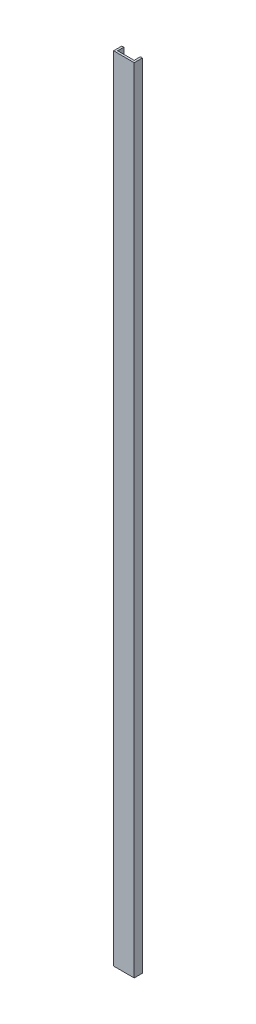
ISO-10303-21;
HEADER;
FILE_DESCRIPTION(('STEP AP214'),'2;1');
FILE_NAME('part.step','',(''),(''),'','','');
FILE_SCHEMA(('AUTOMOTIVE_DESIGN { 1 0 10303 214 1 1 1 1 }'));
ENDSEC;
DATA;
#1=APPLICATION_CONTEXT('core data for automotive mechanical design processes');
#2=APPLICATION_PROTOCOL_DEFINITION('international standard','automotive_design',2000,#1);
#3=PRODUCT_CONTEXT('',#1,'mechanical');
#4=PRODUCT('Part','Part','',(#3));
#5=PRODUCT_RELATED_PRODUCT_CATEGORY('part','',(#4));
#6=PRODUCT_DEFINITION_FORMATION('','',#4);
#7=PRODUCT_DEFINITION_CONTEXT('part definition',#1,'design');
#8=PRODUCT_DEFINITION('design','',#6,#7);
#9=PRODUCT_DEFINITION_SHAPE('','',#8);
#10=(LENGTH_UNIT() NAMED_UNIT(*) SI_UNIT(.MILLI.,.METRE.));
#11=(NAMED_UNIT(*) PLANE_ANGLE_UNIT() SI_UNIT($,.RADIAN.));
#12=(NAMED_UNIT(*) SI_UNIT($,.STERADIAN.) SOLID_ANGLE_UNIT());
#13=UNCERTAINTY_MEASURE_WITH_UNIT(LENGTH_MEASURE(1.E-05),#10,'distance_accuracy_value','');
#14=(GEOMETRIC_REPRESENTATION_CONTEXT(3) GLOBAL_UNCERTAINTY_ASSIGNED_CONTEXT((#13)) GLOBAL_UNIT_ASSIGNED_CONTEXT((#10,
#11,#12)) REPRESENTATION_CONTEXT('',''));
#15=CARTESIAN_POINT('',(0.,0.,0.));
#16=DIRECTION('',(0.,0.,1.));
#17=DIRECTION('',(1.,0.,0.));
#18=AXIS2_PLACEMENT_3D('',#15,#16,#17);
#19=CARTESIAN_POINT('',(0.,1219.2,0.));
#20=DIRECTION('',(1.,0.,0.));
#21=DIRECTION('',(0.,0.,-1.));
#22=AXIS2_PLACEMENT_3D('',#19,#20,#21);
#23=PLANE('',#22);
#24=DIRECTION('',(0.,0.,1.));
#25=VECTOR('',#24,1.);
#26=CARTESIAN_POINT('',(0.,0.,0.));
#27=LINE('',#26,#25);
#28=CARTESIAN_POINT('',(0.,0.,-12.7));
#29=VERTEX_POINT('',#28);
#30=CARTESIAN_POINT('',(0.,0.,0.));
#31=VERTEX_POINT('',#30);
#32=EDGE_CURVE('E136',#29,#31,#27,.T.);
#33=ORIENTED_EDGE('',*,*,#32,.T.);
#34=DIRECTION('',(0.,-1.,0.));
#35=VECTOR('',#34,1.);
#36=CARTESIAN_POINT('',(0.,1219.2,0.));
#37=LINE('',#36,#35);
#38=CARTESIAN_POINT('',(0.,1219.2,0.));
#39=VERTEX_POINT('',#38);
#40=EDGE_CURVE('E11',#39,#31,#37,.T.);
#41=ORIENTED_EDGE('',*,*,#40,.F.);
#42=DIRECTION('',(0.,0.,1.));
#43=VECTOR('',#42,1.);
#44=CARTESIAN_POINT('',(0.,1219.2,0.));
#45=LINE('',#44,#43);
#46=CARTESIAN_POINT('',(0.,1219.2,-12.7));
#47=VERTEX_POINT('',#46);
#48=EDGE_CURVE('E154',#47,#39,#45,.T.);
#49=ORIENTED_EDGE('',*,*,#48,.F.);
#50=DIRECTION('',(0.,-1.,0.));
#51=VECTOR('',#50,1.);
#52=CARTESIAN_POINT('',(0.,1219.2,-12.7));
#53=LINE('',#52,#51);
#54=EDGE_CURVE('E132',#47,#29,#53,.T.);
#55=ORIENTED_EDGE('',*,*,#54,.T.);
#56=EDGE_LOOP('',(#33,#41,#49,#55));
#57=FACE_BOUND('',#56,.T.);
#58=ADVANCED_FACE('F38',(#57),#23,.F.);
#59=CARTESIAN_POINT('',(0.,1219.2,0.));
#60=DIRECTION('',(0.,0.,-1.));
#61=DIRECTION('',(-1.,0.,0.));
#62=AXIS2_PLACEMENT_3D('',#59,#60,#61);
#63=PLANE('',#62);
#64=DIRECTION('',(1.,0.,0.));
#65=VECTOR('',#64,1.);
#66=CARTESIAN_POINT('',(0.,0.,0.));
#67=LINE('',#66,#65);
#68=CARTESIAN_POINT('',(31.75,0.,0.));
#69=VERTEX_POINT('',#68);
#70=EDGE_CURVE('E139',#31,#69,#67,.T.);
#71=ORIENTED_EDGE('',*,*,#70,.T.);
#72=DIRECTION('',(0.,-1.,0.));
#73=VECTOR('',#72,1.);
#74=CARTESIAN_POINT('',(31.75,1219.2,0.));
#75=LINE('',#74,#73);
#76=CARTESIAN_POINT('',(31.75,1219.2,0.));
#77=VERTEX_POINT('',#76);
#78=EDGE_CURVE('E46',#77,#69,#75,.T.);
#79=ORIENTED_EDGE('',*,*,#78,.F.);
#80=DIRECTION('',(1.,0.,0.));
#81=VECTOR('',#80,1.);
#82=CARTESIAN_POINT('',(0.,1219.2,0.));
#83=LINE('',#82,#81);
#84=EDGE_CURVE('E99',#39,#77,#83,.T.);
#85=ORIENTED_EDGE('',*,*,#84,.F.);
#86=ORIENTED_EDGE('',*,*,#40,.T.);
#87=EDGE_LOOP('',(#71,#79,#85,#86));
#88=FACE_BOUND('',#87,.T.);
#89=ADVANCED_FACE('F193',(#88),#63,.F.);
#90=CARTESIAN_POINT('',(31.75,1219.2,0.));
#91=DIRECTION('',(-1.,0.,0.));
#92=DIRECTION('',(0.,0.,1.));
#93=AXIS2_PLACEMENT_3D('',#90,#91,#92);
#94=PLANE('',#93);
#95=DIRECTION('',(0.,0.,-1.));
#96=VECTOR('',#95,1.);
#97=CARTESIAN_POINT('',(31.75,0.,0.));
#98=LINE('',#97,#96);
#99=CARTESIAN_POINT('',(31.75,0.,-12.7));
#100=VERTEX_POINT('',#99);
#101=EDGE_CURVE('E142',#69,#100,#98,.T.);
#102=ORIENTED_EDGE('',*,*,#101,.T.);
#103=DIRECTION('',(0.,-1.,0.));
#104=VECTOR('',#103,1.);
#105=CARTESIAN_POINT('',(31.75,1219.2,-12.7));
#106=LINE('',#105,#104);
#107=CARTESIAN_POINT('',(31.75,1219.2,-12.7));
#108=VERTEX_POINT('',#107);
#109=EDGE_CURVE('E163',#108,#100,#106,.T.);
#110=ORIENTED_EDGE('',*,*,#109,.F.);
#111=DIRECTION('',(0.,0.,-1.));
#112=VECTOR('',#111,1.);
#113=CARTESIAN_POINT('',(31.75,1219.2,0.));
#114=LINE('',#113,#112);
#115=EDGE_CURVE('E173',#77,#108,#114,.T.);
#116=ORIENTED_EDGE('',*,*,#115,.F.);
#117=ORIENTED_EDGE('',*,*,#78,.T.);
#118=EDGE_LOOP('',(#102,#110,#116,#117));
#119=FACE_BOUND('',#118,.T.);
#120=ADVANCED_FACE('F171',(#119),#94,.F.);
#121=CARTESIAN_POINT('',(31.75,1219.2,-12.7));
#122=DIRECTION('',(0.,0.,1.));
#123=DIRECTION('',(1.,0.,0.));
#124=AXIS2_PLACEMENT_3D('',#121,#122,#123);
#125=PLANE('',#124);
#126=DIRECTION('',(-1.,0.,0.));
#127=VECTOR('',#126,1.);
#128=CARTESIAN_POINT('',(31.75,0.,-12.7));
#129=LINE('',#128,#127);
#130=CARTESIAN_POINT('',(28.575,0.,-12.7));
#131=VERTEX_POINT('',#130);
#132=EDGE_CURVE('E145',#100,#131,#129,.T.);
#133=ORIENTED_EDGE('',*,*,#132,.T.);
#134=DIRECTION('',(0.,-1.,0.));
#135=VECTOR('',#134,1.);
#136=CARTESIAN_POINT('',(28.575,1219.2,-12.7));
#137=LINE('',#136,#135);
#138=CARTESIAN_POINT('',(28.575,1219.2,-12.7));
#139=VERTEX_POINT('',#138);
#140=EDGE_CURVE('E159',#139,#131,#137,.T.);
#141=ORIENTED_EDGE('',*,*,#140,.F.);
#142=DIRECTION('',(-1.,0.,0.));
#143=VECTOR('',#142,1.);
#144=CARTESIAN_POINT('',(31.75,1219.2,-12.7));
#145=LINE('',#144,#143);
#146=EDGE_CURVE('E185',#108,#139,#145,.T.);
#147=ORIENTED_EDGE('',*,*,#146,.F.);
#148=ORIENTED_EDGE('',*,*,#109,.T.);
#149=EDGE_LOOP('',(#133,#141,#147,#148));
#150=FACE_BOUND('',#149,.T.);
#151=ADVANCED_FACE('F181',(#150),#125,.F.);
#152=CARTESIAN_POINT('',(28.575,1219.2,-3.175));
#153=DIRECTION('',(1.,0.,0.));
#154=DIRECTION('',(0.,0.,-1.));
#155=AXIS2_PLACEMENT_3D('',#152,#153,#154);
#156=PLANE('',#155);
#157=DIRECTION('',(0.,0.,1.));
#158=VECTOR('',#157,1.);
#159=CARTESIAN_POINT('',(28.575,0.,-3.175));
#160=LINE('',#159,#158);
#161=CARTESIAN_POINT('',(28.575,0.,-3.175));
#162=VERTEX_POINT('',#161);
#163=EDGE_CURVE('E147',#131,#162,#160,.T.);
#164=ORIENTED_EDGE('',*,*,#163,.T.);
#165=DIRECTION('',(0.,-1.,0.));
#166=VECTOR('',#165,1.);
#167=CARTESIAN_POINT('',(28.575,1219.2,-3.175));
#168=LINE('',#167,#166);
#169=CARTESIAN_POINT('',(28.575,1219.2,-3.175));
#170=VERTEX_POINT('',#169);
#171=EDGE_CURVE('E127',#170,#162,#168,.T.);
#172=ORIENTED_EDGE('',*,*,#171,.F.);
#173=DIRECTION('',(0.,0.,1.));
#174=VECTOR('',#173,1.);
#175=CARTESIAN_POINT('',(28.575,1219.2,-3.175));
#176=LINE('',#175,#174);
#177=EDGE_CURVE('E118',#139,#170,#176,.T.);
#178=ORIENTED_EDGE('',*,*,#177,.F.);
#179=ORIENTED_EDGE('',*,*,#140,.T.);
#180=EDGE_LOOP('',(#164,#172,#178,#179));
#181=FACE_BOUND('',#180,.T.);
#182=ADVANCED_FACE('F184',(#181),#156,.F.);
#183=CARTESIAN_POINT('',(3.175,1219.2,-3.175));
#184=DIRECTION('',(0.,0.,1.));
#185=DIRECTION('',(1.,0.,0.));
#186=AXIS2_PLACEMENT_3D('',#183,#184,#185);
#187=PLANE('',#186);
#188=DIRECTION('',(-1.,0.,0.));
#189=VECTOR('',#188,1.);
#190=CARTESIAN_POINT('',(3.175,0.,-3.175));
#191=LINE('',#190,#189);
#192=CARTESIAN_POINT('',(3.175,0.,-3.175));
#193=VERTEX_POINT('',#192);
#194=EDGE_CURVE('E126',#162,#193,#191,.T.);
#195=ORIENTED_EDGE('',*,*,#194,.T.);
#196=DIRECTION('',(0.,-1.,0.));
#197=VECTOR('',#196,1.);
#198=CARTESIAN_POINT('',(3.175,1219.2,-3.175));
#199=LINE('',#198,#197);
#200=CARTESIAN_POINT('',(3.175,1219.2,-3.175));
#201=VERTEX_POINT('',#200);
#202=EDGE_CURVE('E123',#201,#193,#199,.T.);
#203=ORIENTED_EDGE('',*,*,#202,.F.);
#204=DIRECTION('',(-1.,0.,0.));
#205=VECTOR('',#204,1.);
#206=CARTESIAN_POINT('',(3.175,1219.2,-3.175));
#207=LINE('',#206,#205);
#208=EDGE_CURVE('E112',#170,#201,#207,.T.);
#209=ORIENTED_EDGE('',*,*,#208,.F.);
#210=ORIENTED_EDGE('',*,*,#171,.T.);
#211=EDGE_LOOP('',(#195,#203,#209,#210));
#212=FACE_BOUND('',#211,.T.);
#213=ADVANCED_FACE('F124',(#212),#187,.F.);
#214=CARTESIAN_POINT('',(3.175,1219.2,-3.175));
#215=DIRECTION('',(-1.,0.,0.));
#216=DIRECTION('',(0.,0.,1.));
#217=AXIS2_PLACEMENT_3D('',#214,#215,#216);
#218=PLANE('',#217);
#219=DIRECTION('',(0.,0.,-1.));
#220=VECTOR('',#219,1.);
#221=CARTESIAN_POINT('',(3.175,0.,-3.175));
#222=LINE('',#221,#220);
#223=CARTESIAN_POINT('',(3.175,0.,-12.7));
#224=VERTEX_POINT('',#223);
#225=EDGE_CURVE('E85',#193,#224,#222,.T.);
#226=ORIENTED_EDGE('',*,*,#225,.T.);
#227=DIRECTION('',(0.,-1.,0.));
#228=VECTOR('',#227,1.);
#229=CARTESIAN_POINT('',(3.175,1219.2,-12.7));
#230=LINE('',#229,#228);
#231=CARTESIAN_POINT('',(3.175,1219.2,-12.7));
#232=VERTEX_POINT('',#231);
#233=EDGE_CURVE('E128',#232,#224,#230,.T.);
#234=ORIENTED_EDGE('',*,*,#233,.F.);
#235=DIRECTION('',(0.,0.,-1.));
#236=VECTOR('',#235,1.);
#237=CARTESIAN_POINT('',(3.175,1219.2,-3.175));
#238=LINE('',#237,#236);
#239=EDGE_CURVE('E116',#201,#232,#238,.T.);
#240=ORIENTED_EDGE('',*,*,#239,.F.);
#241=ORIENTED_EDGE('',*,*,#202,.T.);
#242=EDGE_LOOP('',(#226,#234,#240,#241));
#243=FACE_BOUND('',#242,.T.);
#244=ADVANCED_FACE('F130',(#243),#218,.F.);
#245=CARTESIAN_POINT('',(0.,1219.2,-12.7));
#246=DIRECTION('',(0.,0.,1.));
#247=DIRECTION('',(1.,0.,0.));
#248=AXIS2_PLACEMENT_3D('',#245,#246,#247);
#249=PLANE('',#248);
#250=DIRECTION('',(-1.,0.,0.));
#251=VECTOR('',#250,1.);
#252=CARTESIAN_POINT('',(0.,0.,-12.7));
#253=LINE('',#252,#251);
#254=EDGE_CURVE('E91',#224,#29,#253,.T.);
#255=ORIENTED_EDGE('',*,*,#254,.T.);
#256=ORIENTED_EDGE('',*,*,#54,.F.);
#257=DIRECTION('',(-1.,0.,0.));
#258=VECTOR('',#257,1.);
#259=CARTESIAN_POINT('',(0.,1219.2,-12.7));
#260=LINE('',#259,#258);
#261=EDGE_CURVE('E54',#232,#47,#260,.T.);
#262=ORIENTED_EDGE('',*,*,#261,.F.);
#263=ORIENTED_EDGE('',*,*,#233,.T.);
#264=EDGE_LOOP('',(#255,#256,#262,#263));
#265=FACE_BOUND('',#264,.T.);
#266=ADVANCED_FACE('F208',(#265),#249,.F.);
#267=CARTESIAN_POINT('',(0.,1219.2,0.));
#268=DIRECTION('',(0.,-1.,0.));
#269=DIRECTION('',(0.,0.,-1.));
#270=AXIS2_PLACEMENT_3D('',#267,#268,#269);
#271=PLANE('',#270);
#272=ORIENTED_EDGE('',*,*,#48,.T.);
#273=ORIENTED_EDGE('',*,*,#84,.T.);
#274=ORIENTED_EDGE('',*,*,#115,.T.);
#275=ORIENTED_EDGE('',*,*,#146,.T.);
#276=ORIENTED_EDGE('',*,*,#177,.T.);
#277=ORIENTED_EDGE('',*,*,#208,.T.);
#278=ORIENTED_EDGE('',*,*,#239,.T.);
#279=ORIENTED_EDGE('',*,*,#261,.T.);
#280=EDGE_LOOP('',(#272,#273,#274,#275,#276,#277,#278,#279));
#281=FACE_BOUND('',#280,.T.);
#282=ADVANCED_FACE('F114',(#281),#271,.F.);
#283=CARTESIAN_POINT('',(0.,0.,0.));
#284=DIRECTION('',(0.,-1.,0.));
#285=DIRECTION('',(0.,0.,-1.));
#286=AXIS2_PLACEMENT_3D('',#283,#284,#285);
#287=PLANE('',#286);
#288=ORIENTED_EDGE('',*,*,#32,.F.);
#289=ORIENTED_EDGE('',*,*,#254,.F.);
#290=ORIENTED_EDGE('',*,*,#225,.F.);
#291=ORIENTED_EDGE('',*,*,#194,.F.);
#292=ORIENTED_EDGE('',*,*,#163,.F.);
#293=ORIENTED_EDGE('',*,*,#132,.F.);
#294=ORIENTED_EDGE('',*,*,#101,.F.);
#295=ORIENTED_EDGE('',*,*,#70,.F.);
#296=EDGE_LOOP('',(#288,#289,#290,#291,#292,#293,#294,#295));
#297=FACE_BOUND('',#296,.T.);
#298=ADVANCED_FACE('F177',(#297),#287,.T.);
#299=CLOSED_SHELL('',(#58,#89,#120,#151,#182,#213,#244,#266,#282,#298));
#300=MANIFOLD_SOLID_BREP('B2',#299);
#301=ADVANCED_BREP_SHAPE_REPRESENTATION('',(#18,#300),#14);
#302=SHAPE_DEFINITION_REPRESENTATION(#9,#301);
ENDSEC;
END-ISO-10303-21;
